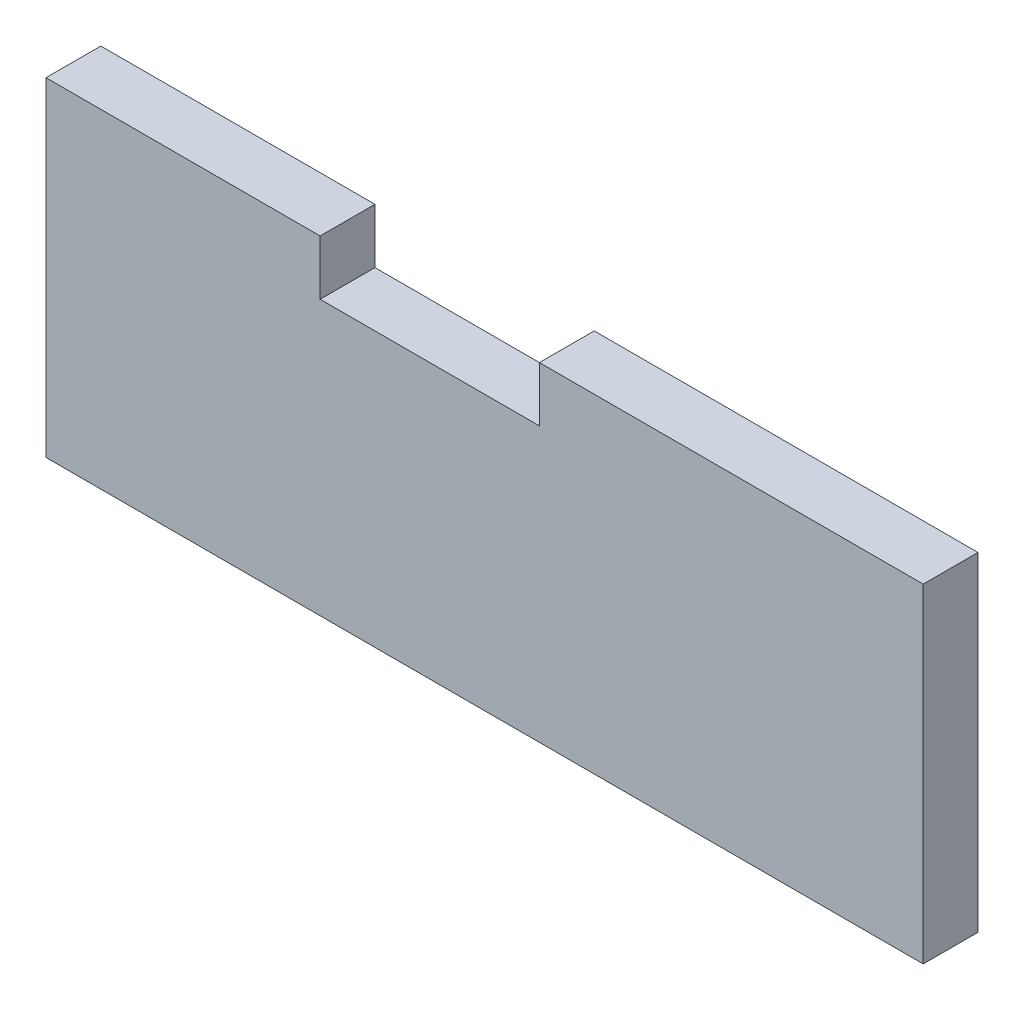
ISO-10303-21;
HEADER;
FILE_DESCRIPTION(('STEP AP214'),'2;1');
FILE_NAME('part.step','',(''),(''),'','','');
FILE_SCHEMA(('AUTOMOTIVE_DESIGN { 1 0 10303 214 1 1 1 1 }'));
ENDSEC;
DATA;
#1=APPLICATION_CONTEXT('core data for automotive mechanical design processes');
#2=APPLICATION_PROTOCOL_DEFINITION('international standard','automotive_design',2000,#1);
#3=PRODUCT_CONTEXT('',#1,'mechanical');
#4=PRODUCT('Part','Part','',(#3));
#5=PRODUCT_RELATED_PRODUCT_CATEGORY('part','',(#4));
#6=PRODUCT_DEFINITION_FORMATION('','',#4);
#7=PRODUCT_DEFINITION_CONTEXT('part definition',#1,'design');
#8=PRODUCT_DEFINITION('design','',#6,#7);
#9=PRODUCT_DEFINITION_SHAPE('','',#8);
#10=(LENGTH_UNIT() NAMED_UNIT(*) SI_UNIT(.MILLI.,.METRE.));
#11=(NAMED_UNIT(*) PLANE_ANGLE_UNIT() SI_UNIT($,.RADIAN.));
#12=(NAMED_UNIT(*) SI_UNIT($,.STERADIAN.) SOLID_ANGLE_UNIT());
#13=UNCERTAINTY_MEASURE_WITH_UNIT(LENGTH_MEASURE(1.E-05),#10,'distance_accuracy_value','');
#14=(GEOMETRIC_REPRESENTATION_CONTEXT(3) GLOBAL_UNCERTAINTY_ASSIGNED_CONTEXT((#13)) GLOBAL_UNIT_ASSIGNED_CONTEXT((#10,
#11,#12)) REPRESENTATION_CONTEXT('',''));
#15=CARTESIAN_POINT('',(0.,0.,0.));
#16=DIRECTION('',(0.,0.,1.));
#17=DIRECTION('',(1.,0.,0.));
#18=AXIS2_PLACEMENT_3D('',#15,#16,#17);
#19=CARTESIAN_POINT('',(-40.,15.,5.));
#20=DIRECTION('',(0.,-1.,0.));
#21=DIRECTION('',(0.,0.,-1.));
#22=AXIS2_PLACEMENT_3D('',#19,#20,#21);
#23=PLANE('',#22);
#24=DIRECTION('',(-1.,0.,0.));
#25=VECTOR('',#24,1.);
#26=CARTESIAN_POINT('',(-40.,15.,0.));
#27=LINE('',#26,#25);
#28=CARTESIAN_POINT('',(40.,15.,0.));
#29=VERTEX_POINT('',#28);
#30=CARTESIAN_POINT('',(5.,15.,0.));
#31=VERTEX_POINT('',#30);
#32=EDGE_CURVE('E160',#29,#31,#27,.T.);
#33=ORIENTED_EDGE('',*,*,#32,.T.);
#34=DIRECTION('',(0.,0.,-1.));
#35=VECTOR('',#34,1.);
#36=CARTESIAN_POINT('',(5.,15.,10.));
#37=LINE('',#36,#35);
#38=CARTESIAN_POINT('',(5.,15.,5.));
#39=VERTEX_POINT('',#38);
#40=EDGE_CURVE('E140',#39,#31,#37,.T.);
#41=ORIENTED_EDGE('',*,*,#40,.F.);
#42=DIRECTION('',(-1.,0.,0.));
#43=VECTOR('',#42,1.);
#44=CARTESIAN_POINT('',(-40.,15.,5.));
#45=LINE('',#44,#43);
#46=CARTESIAN_POINT('',(40.,15.,5.));
#47=VERTEX_POINT('',#46);
#48=EDGE_CURVE('E91',#47,#39,#45,.T.);
#49=ORIENTED_EDGE('',*,*,#48,.F.);
#50=DIRECTION('',(0.,0.,-1.));
#51=VECTOR('',#50,1.);
#52=CARTESIAN_POINT('',(40.,15.,5.));
#53=LINE('',#52,#51);
#54=EDGE_CURVE('E11',#47,#29,#53,.T.);
#55=ORIENTED_EDGE('',*,*,#54,.T.);
#56=EDGE_LOOP('',(#33,#41,#49,#55));
#57=FACE_BOUND('',#56,.T.);
#58=ADVANCED_FACE('F39',(#57),#23,.F.);
#59=CARTESIAN_POINT('',(40.,-15.,5.));
#60=DIRECTION('',(-1.,0.,0.));
#61=DIRECTION('',(0.,0.,1.));
#62=AXIS2_PLACEMENT_3D('',#59,#60,#61);
#63=PLANE('',#62);
#64=DIRECTION('',(0.,1.,0.));
#65=VECTOR('',#64,1.);
#66=CARTESIAN_POINT('',(40.,-15.,0.));
#67=LINE('',#66,#65);
#68=CARTESIAN_POINT('',(40.,-15.,0.));
#69=VERTEX_POINT('',#68);
#70=EDGE_CURVE('E149',#69,#29,#67,.T.);
#71=ORIENTED_EDGE('',*,*,#70,.T.);
#72=ORIENTED_EDGE('',*,*,#54,.F.);
#73=DIRECTION('',(0.,1.,0.));
#74=VECTOR('',#73,1.);
#75=CARTESIAN_POINT('',(40.,-15.,5.));
#76=LINE('',#75,#74);
#77=CARTESIAN_POINT('',(40.,-15.,5.));
#78=VERTEX_POINT('',#77);
#79=EDGE_CURVE('E150',#78,#47,#76,.T.);
#80=ORIENTED_EDGE('',*,*,#79,.F.);
#81=DIRECTION('',(0.,0.,-1.));
#82=VECTOR('',#81,1.);
#83=CARTESIAN_POINT('',(40.,-15.,5.));
#84=LINE('',#83,#82);
#85=EDGE_CURVE('E157',#78,#69,#84,.T.);
#86=ORIENTED_EDGE('',*,*,#85,.T.);
#87=EDGE_LOOP('',(#71,#72,#80,#86));
#88=FACE_BOUND('',#87,.T.);
#89=ADVANCED_FACE('F41',(#88),#63,.F.);
#90=CARTESIAN_POINT('',(-15.,15.,5.));
#91=VERTEX_POINT('',#90);
#92=CARTESIAN_POINT('',(-40.,15.,5.));
#93=VERTEX_POINT('',#92);
#94=EDGE_CURVE('E152',#91,#93,#45,.T.);
#95=ORIENTED_EDGE('',*,*,#94,.F.);
#96=DIRECTION('',(0.,0.,-1.));
#97=VECTOR('',#96,1.);
#98=CARTESIAN_POINT('',(-15.,15.,10.));
#99=LINE('',#98,#97);
#100=CARTESIAN_POINT('',(-15.,15.,0.));
#101=VERTEX_POINT('',#100);
#102=EDGE_CURVE('E124',#91,#101,#99,.T.);
#103=ORIENTED_EDGE('',*,*,#102,.T.);
#104=CARTESIAN_POINT('',(-40.,15.,0.));
#105=VERTEX_POINT('',#104);
#106=EDGE_CURVE('E135',#101,#105,#27,.T.);
#107=ORIENTED_EDGE('',*,*,#106,.T.);
#108=DIRECTION('',(0.,0.,-1.));
#109=VECTOR('',#108,1.);
#110=CARTESIAN_POINT('',(-40.,15.,5.));
#111=LINE('',#110,#109);
#112=EDGE_CURVE('E47',#93,#105,#111,.T.);
#113=ORIENTED_EDGE('',*,*,#112,.F.);
#114=EDGE_LOOP('',(#95,#103,#107,#113));
#115=FACE_BOUND('',#114,.T.);
#116=ADVANCED_FACE('F190',(#115),#23,.F.);
#117=CARTESIAN_POINT('',(-40.,-15.,5.));
#118=DIRECTION('',(1.,0.,0.));
#119=DIRECTION('',(0.,0.,-1.));
#120=AXIS2_PLACEMENT_3D('',#117,#118,#119);
#121=PLANE('',#120);
#122=DIRECTION('',(0.,-1.,0.));
#123=VECTOR('',#122,1.);
#124=CARTESIAN_POINT('',(-40.,-15.,0.));
#125=LINE('',#124,#123);
#126=CARTESIAN_POINT('',(-40.,-15.,0.));
#127=VERTEX_POINT('',#126);
#128=EDGE_CURVE('E163',#105,#127,#125,.T.);
#129=ORIENTED_EDGE('',*,*,#128,.T.);
#130=DIRECTION('',(0.,0.,-1.));
#131=VECTOR('',#130,1.);
#132=CARTESIAN_POINT('',(-40.,-15.,5.));
#133=LINE('',#132,#131);
#134=CARTESIAN_POINT('',(-40.,-15.,5.));
#135=VERTEX_POINT('',#134);
#136=EDGE_CURVE('E167',#135,#127,#133,.T.);
#137=ORIENTED_EDGE('',*,*,#136,.F.);
#138=DIRECTION('',(0.,-1.,0.));
#139=VECTOR('',#138,1.);
#140=CARTESIAN_POINT('',(-40.,-15.,5.));
#141=LINE('',#140,#139);
#142=EDGE_CURVE('E154',#93,#135,#141,.T.);
#143=ORIENTED_EDGE('',*,*,#142,.F.);
#144=ORIENTED_EDGE('',*,*,#112,.T.);
#145=EDGE_LOOP('',(#129,#137,#143,#144));
#146=FACE_BOUND('',#145,.T.);
#147=ADVANCED_FACE('F172',(#146),#121,.F.);
#148=CARTESIAN_POINT('',(-40.,-15.,5.));
#149=DIRECTION('',(0.,1.,0.));
#150=DIRECTION('',(0.,0.,1.));
#151=AXIS2_PLACEMENT_3D('',#148,#149,#150);
#152=PLANE('',#151);
#153=DIRECTION('',(1.,0.,0.));
#154=VECTOR('',#153,1.);
#155=CARTESIAN_POINT('',(-40.,-15.,0.));
#156=LINE('',#155,#154);
#157=EDGE_CURVE('E84',#127,#69,#156,.T.);
#158=ORIENTED_EDGE('',*,*,#157,.T.);
#159=ORIENTED_EDGE('',*,*,#85,.F.);
#160=DIRECTION('',(1.,0.,0.));
#161=VECTOR('',#160,1.);
#162=CARTESIAN_POINT('',(-40.,-15.,5.));
#163=LINE('',#162,#161);
#164=EDGE_CURVE('E63',#135,#78,#163,.T.);
#165=ORIENTED_EDGE('',*,*,#164,.F.);
#166=ORIENTED_EDGE('',*,*,#136,.T.);
#167=EDGE_LOOP('',(#158,#159,#165,#166));
#168=FACE_BOUND('',#167,.T.);
#169=ADVANCED_FACE('F180',(#168),#152,.F.);
#170=CARTESIAN_POINT('',(0.,0.,5.));
#171=DIRECTION('',(0.,0.,-1.));
#172=DIRECTION('',(-1.,0.,0.));
#173=AXIS2_PLACEMENT_3D('',#170,#171,#172);
#174=PLANE('',#173);
#175=ORIENTED_EDGE('',*,*,#48,.T.);
#176=DIRECTION('',(0.,-1.,0.));
#177=VECTOR('',#176,1.);
#178=CARTESIAN_POINT('',(5.,0.,5.));
#179=LINE('',#178,#177);
#180=CARTESIAN_POINT('',(5.,9.99999999999999,5.));
#181=VERTEX_POINT('',#180);
#182=EDGE_CURVE('E146',#39,#181,#179,.T.);
#183=ORIENTED_EDGE('',*,*,#182,.T.);
#184=DIRECTION('',(-1.,0.,0.));
#185=VECTOR('',#184,1.);
#186=CARTESIAN_POINT('',(0.,9.99999999999999,5.));
#187=LINE('',#186,#185);
#188=CARTESIAN_POINT('',(-15.,9.99999999999999,5.));
#189=VERTEX_POINT('',#188);
#190=EDGE_CURVE('E142',#181,#189,#187,.T.);
#191=ORIENTED_EDGE('',*,*,#190,.T.);
#192=DIRECTION('',(0.,1.,0.));
#193=VECTOR('',#192,1.);
#194=CARTESIAN_POINT('',(-15.,0.,5.));
#195=LINE('',#194,#193);
#196=EDGE_CURVE('E121',#189,#91,#195,.T.);
#197=ORIENTED_EDGE('',*,*,#196,.T.);
#198=ORIENTED_EDGE('',*,*,#94,.T.);
#199=ORIENTED_EDGE('',*,*,#142,.T.);
#200=ORIENTED_EDGE('',*,*,#164,.T.);
#201=ORIENTED_EDGE('',*,*,#79,.T.);
#202=EDGE_LOOP('',(#175,#183,#191,#197,#198,#199,#200,#201));
#203=FACE_BOUND('',#202,.T.);
#204=ADVANCED_FACE('F182',(#203),#174,.F.);
#205=CARTESIAN_POINT('',(0.,0.,0.));
#206=DIRECTION('',(0.,0.,-1.));
#207=DIRECTION('',(-1.,0.,0.));
#208=AXIS2_PLACEMENT_3D('',#205,#206,#207);
#209=PLANE('',#208);
#210=DIRECTION('',(0.,-1.,0.));
#211=VECTOR('',#210,1.);
#212=CARTESIAN_POINT('',(5.,15.,0.));
#213=LINE('',#212,#211);
#214=CARTESIAN_POINT('',(5.,9.99999999999999,0.));
#215=VERTEX_POINT('',#214);
#216=EDGE_CURVE('E54',#31,#215,#213,.T.);
#217=ORIENTED_EDGE('',*,*,#216,.F.);
#218=ORIENTED_EDGE('',*,*,#32,.F.);
#219=ORIENTED_EDGE('',*,*,#70,.F.);
#220=ORIENTED_EDGE('',*,*,#157,.F.);
#221=ORIENTED_EDGE('',*,*,#128,.F.);
#222=ORIENTED_EDGE('',*,*,#106,.F.);
#223=DIRECTION('',(0.,1.,0.));
#224=VECTOR('',#223,1.);
#225=CARTESIAN_POINT('',(-15.,15.,0.));
#226=LINE('',#225,#224);
#227=CARTESIAN_POINT('',(-15.,9.99999999999999,0.));
#228=VERTEX_POINT('',#227);
#229=EDGE_CURVE('E118',#228,#101,#226,.T.);
#230=ORIENTED_EDGE('',*,*,#229,.F.);
#231=DIRECTION('',(-1.,0.,0.));
#232=VECTOR('',#231,1.);
#233=CARTESIAN_POINT('',(5.,9.99999999999999,0.));
#234=LINE('',#233,#232);
#235=EDGE_CURVE('E128',#215,#228,#234,.T.);
#236=ORIENTED_EDGE('',*,*,#235,.F.);
#237=EDGE_LOOP('',(#217,#218,#219,#220,#221,#222,#230,#236));
#238=FACE_BOUND('',#237,.T.);
#239=ADVANCED_FACE('F133',(#238),#209,.T.);
#240=CARTESIAN_POINT('',(5.,15.,10.));
#241=DIRECTION('',(1.,0.,0.));
#242=DIRECTION('',(0.,1.,0.));
#243=AXIS2_PLACEMENT_3D('',#240,#241,#242);
#244=PLANE('',#243);
#245=ORIENTED_EDGE('',*,*,#40,.T.);
#246=ORIENTED_EDGE('',*,*,#216,.T.);
#247=DIRECTION('',(0.,0.,-1.));
#248=VECTOR('',#247,1.);
#249=CARTESIAN_POINT('',(5.,9.99999999999999,10.));
#250=LINE('',#249,#248);
#251=EDGE_CURVE('E125',#181,#215,#250,.T.);
#252=ORIENTED_EDGE('',*,*,#251,.F.);
#253=ORIENTED_EDGE('',*,*,#182,.F.);
#254=EDGE_LOOP('',(#245,#246,#252,#253));
#255=FACE_BOUND('',#254,.T.);
#256=ADVANCED_FACE('F199',(#255),#244,.F.);
#257=CARTESIAN_POINT('',(-15.,15.,10.));
#258=DIRECTION('',(-1.,0.,0.));
#259=DIRECTION('',(0.,-1.,0.));
#260=AXIS2_PLACEMENT_3D('',#257,#258,#259);
#261=PLANE('',#260);
#262=DIRECTION('',(0.,0.,-1.));
#263=VECTOR('',#262,1.);
#264=CARTESIAN_POINT('',(-15.,9.99999999999999,10.));
#265=LINE('',#264,#263);
#266=EDGE_CURVE('E114',#189,#228,#265,.T.);
#267=ORIENTED_EDGE('',*,*,#266,.T.);
#268=ORIENTED_EDGE('',*,*,#229,.T.);
#269=ORIENTED_EDGE('',*,*,#102,.F.);
#270=ORIENTED_EDGE('',*,*,#196,.F.);
#271=EDGE_LOOP('',(#267,#268,#269,#270));
#272=FACE_BOUND('',#271,.T.);
#273=ADVANCED_FACE('F116',(#272),#261,.F.);
#274=CARTESIAN_POINT('',(5.,9.99999999999999,10.));
#275=DIRECTION('',(0.,-1.,0.));
#276=DIRECTION('',(0.,0.,-1.));
#277=AXIS2_PLACEMENT_3D('',#274,#275,#276);
#278=PLANE('',#277);
#279=ORIENTED_EDGE('',*,*,#251,.T.);
#280=ORIENTED_EDGE('',*,*,#235,.T.);
#281=ORIENTED_EDGE('',*,*,#266,.F.);
#282=ORIENTED_EDGE('',*,*,#190,.F.);
#283=EDGE_LOOP('',(#279,#280,#281,#282));
#284=FACE_BOUND('',#283,.T.);
#285=ADVANCED_FACE('F129',(#284),#278,.F.);
#286=CLOSED_SHELL('',(#58,#89,#116,#147,#169,#204,#239,#256,#273,#285));
#287=MANIFOLD_SOLID_BREP('B2',#286);
#288=ADVANCED_BREP_SHAPE_REPRESENTATION('',(#18,#287),#14);
#289=SHAPE_DEFINITION_REPRESENTATION(#9,#288);
ENDSEC;
END-ISO-10303-21;
